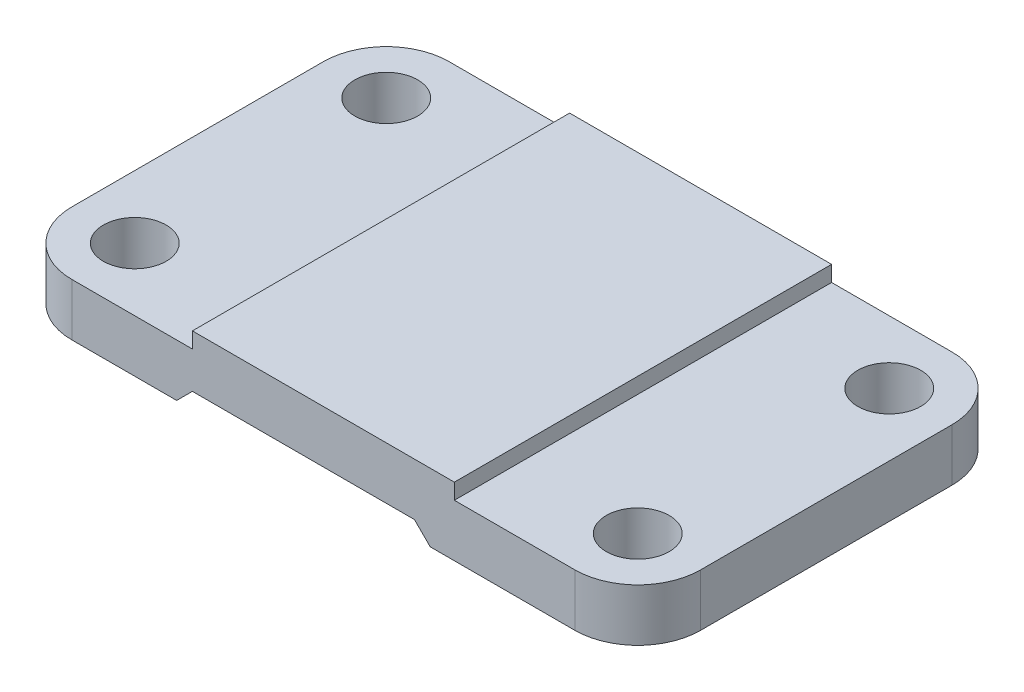
ISO-10303-21;
HEADER;
FILE_DESCRIPTION(('STEP AP214'),'2;1');
FILE_NAME('part.step','',(''),(''),'','','');
FILE_SCHEMA(('AUTOMOTIVE_DESIGN { 1 0 10303 214 1 1 1 1 }'));
ENDSEC;
DATA;
#1=APPLICATION_CONTEXT('core data for automotive mechanical design processes');
#2=APPLICATION_PROTOCOL_DEFINITION('international standard','automotive_design',2000,#1);
#3=PRODUCT_CONTEXT('',#1,'mechanical');
#4=PRODUCT('Part','Part','',(#3));
#5=PRODUCT_RELATED_PRODUCT_CATEGORY('part','',(#4));
#6=PRODUCT_DEFINITION_FORMATION('','',#4);
#7=PRODUCT_DEFINITION_CONTEXT('part definition',#1,'design');
#8=PRODUCT_DEFINITION('design','',#6,#7);
#9=PRODUCT_DEFINITION_SHAPE('','',#8);
#10=(LENGTH_UNIT() NAMED_UNIT(*) SI_UNIT(.MILLI.,.METRE.));
#11=(NAMED_UNIT(*) PLANE_ANGLE_UNIT() SI_UNIT($,.RADIAN.));
#12=(NAMED_UNIT(*) SI_UNIT($,.STERADIAN.) SOLID_ANGLE_UNIT());
#13=UNCERTAINTY_MEASURE_WITH_UNIT(LENGTH_MEASURE(1.E-05),#10,'distance_accuracy_value','');
#14=(GEOMETRIC_REPRESENTATION_CONTEXT(3) GLOBAL_UNCERTAINTY_ASSIGNED_CONTEXT((#13)) GLOBAL_UNIT_ASSIGNED_CONTEXT((#10,
#11,#12)) REPRESENTATION_CONTEXT('',''));
#15=CARTESIAN_POINT('',(0.,0.,0.));
#16=DIRECTION('',(0.,0.,1.));
#17=DIRECTION('',(1.,0.,0.));
#18=AXIS2_PLACEMENT_3D('',#15,#16,#17);
#19=CARTESIAN_POINT('',(0.,10.,0.));
#20=DIRECTION('',(0.,-1.,0.));
#21=DIRECTION('',(0.,0.,-1.));
#22=AXIS2_PLACEMENT_3D('',#19,#20,#21);
#23=PLANE('',#22);
#24=CARTESIAN_POINT('',(48.,10.,24.));
#25=DIRECTION('',(0.,1.,0.));
#26=DIRECTION('',(0.,0.,1.));
#27=AXIS2_PLACEMENT_3D('',#24,#25,#26);
#28=CIRCLE('',#27,6.);
#29=CARTESIAN_POINT('',(48.,10.,30.));
#30=VERTEX_POINT('',#29);
#31=EDGE_CURVE('E212',#30,#30,#28,.T.);
#32=ORIENTED_EDGE('',*,*,#31,.F.);
#33=EDGE_LOOP('',(#32));
#34=FACE_BOUND('',#33,.T.);
#35=CARTESIAN_POINT('',(48.,10.,-24.));
#36=DIRECTION('',(0.,1.,0.));
#37=DIRECTION('',(0.,0.,1.));
#38=AXIS2_PLACEMENT_3D('',#35,#36,#37);
#39=CIRCLE('',#38,6.);
#40=CARTESIAN_POINT('',(48.,10.,-18.));
#41=VERTEX_POINT('',#40);
#42=EDGE_CURVE('E196',#41,#41,#39,.T.);
#43=ORIENTED_EDGE('',*,*,#42,.F.);
#44=EDGE_LOOP('',(#43));
#45=FACE_BOUND('',#44,.T.);
#46=DIRECTION('',(0.,0.,-1.));
#47=VECTOR('',#46,1.);
#48=CARTESIAN_POINT('',(25.,10.,36.));
#49=LINE('',#48,#47);
#50=CARTESIAN_POINT('',(25.,10.,36.));
#51=VERTEX_POINT('',#50);
#52=CARTESIAN_POINT('',(25.,10.,-36.));
#53=VERTEX_POINT('',#52);
#54=EDGE_CURVE('E170',#51,#53,#49,.T.);
#55=ORIENTED_EDGE('',*,*,#54,.F.);
#56=DIRECTION('',(1.,0.,0.));
#57=VECTOR('',#56,1.);
#58=CARTESIAN_POINT('',(-60.,10.,36.));
#59=LINE('',#58,#57);
#60=CARTESIAN_POINT('',(48.,10.,36.));
#61=VERTEX_POINT('',#60);
#62=EDGE_CURVE('E235',#51,#61,#59,.T.);
#63=ORIENTED_EDGE('',*,*,#62,.T.);
#64=CARTESIAN_POINT('',(48.,10.,24.));
#65=DIRECTION('',(0.,-1.,0.));
#66=DIRECTION('',(0.,0.,-1.));
#67=AXIS2_PLACEMENT_3D('',#64,#65,#66);
#68=CIRCLE('',#67,12.);
#69=CARTESIAN_POINT('',(60.,10.,24.));
#70=VERTEX_POINT('',#69);
#71=EDGE_CURVE('E277',#61,#70,#68,.F.);
#72=ORIENTED_EDGE('',*,*,#71,.T.);
#73=DIRECTION('',(0.,0.,-1.));
#74=VECTOR('',#73,1.);
#75=CARTESIAN_POINT('',(60.,10.,36.));
#76=LINE('',#75,#74);
#77=CARTESIAN_POINT('',(60.,10.,-24.));
#78=VERTEX_POINT('',#77);
#79=EDGE_CURVE('E226',#70,#78,#76,.T.);
#80=ORIENTED_EDGE('',*,*,#79,.T.);
#81=CARTESIAN_POINT('',(48.,10.,-24.));
#82=DIRECTION('',(0.,-1.,0.));
#83=DIRECTION('',(0.,0.,-1.));
#84=AXIS2_PLACEMENT_3D('',#81,#82,#83);
#85=CIRCLE('',#84,12.);
#86=CARTESIAN_POINT('',(48.,10.,-36.));
#87=VERTEX_POINT('',#86);
#88=EDGE_CURVE('E275',#78,#87,#85,.F.);
#89=ORIENTED_EDGE('',*,*,#88,.T.);
#90=DIRECTION('',(-1.,0.,0.));
#91=VECTOR('',#90,1.);
#92=CARTESIAN_POINT('',(-60.,10.,-36.));
#93=LINE('',#92,#91);
#94=EDGE_CURVE('E59',#87,#53,#93,.T.);
#95=ORIENTED_EDGE('',*,*,#94,.T.);
#96=EDGE_LOOP('',(#55,#63,#72,#80,#89,#95));
#97=FACE_BOUND('',#96,.T.);
#98=ADVANCED_FACE('F36',(#34,#45,#97),#23,.F.);
#99=CARTESIAN_POINT('',(-48.,10.,-24.));
#100=DIRECTION('',(0.,1.,0.));
#101=DIRECTION('',(0.,0.,1.));
#102=AXIS2_PLACEMENT_3D('',#99,#100,#101);
#103=CIRCLE('',#102,6.);
#104=CARTESIAN_POINT('',(-48.,10.,-18.));
#105=VERTEX_POINT('',#104);
#106=EDGE_CURVE('E205',#105,#105,#103,.T.);
#107=ORIENTED_EDGE('',*,*,#106,.F.);
#108=EDGE_LOOP('',(#107));
#109=FACE_BOUND('',#108,.T.);
#110=CARTESIAN_POINT('',(-48.,10.,24.));
#111=DIRECTION('',(0.,1.,0.));
#112=DIRECTION('',(0.,0.,1.));
#113=AXIS2_PLACEMENT_3D('',#110,#111,#112);
#114=CIRCLE('',#113,6.);
#115=CARTESIAN_POINT('',(-48.,10.,30.));
#116=VERTEX_POINT('',#115);
#117=EDGE_CURVE('E206',#116,#116,#114,.T.);
#118=ORIENTED_EDGE('',*,*,#117,.F.);
#119=EDGE_LOOP('',(#118));
#120=FACE_BOUND('',#119,.T.);
#121=DIRECTION('',(0.,0.,1.));
#122=VECTOR('',#121,1.);
#123=CARTESIAN_POINT('',(-25.,10.,36.));
#124=LINE('',#123,#122);
#125=CARTESIAN_POINT('',(-25.,10.,-36.));
#126=VERTEX_POINT('',#125);
#127=CARTESIAN_POINT('',(-25.,10.,36.));
#128=VERTEX_POINT('',#127);
#129=EDGE_CURVE('E51',#126,#128,#124,.T.);
#130=ORIENTED_EDGE('',*,*,#129,.F.);
#131=CARTESIAN_POINT('',(-48.,10.,-36.));
#132=VERTEX_POINT('',#131);
#133=EDGE_CURVE('E229',#126,#132,#93,.T.);
#134=ORIENTED_EDGE('',*,*,#133,.T.);
#135=CARTESIAN_POINT('',(-48.,10.,-24.));
#136=DIRECTION('',(0.,-1.,0.));
#137=DIRECTION('',(0.,0.,-1.));
#138=AXIS2_PLACEMENT_3D('',#135,#136,#137);
#139=CIRCLE('',#138,12.);
#140=CARTESIAN_POINT('',(-60.,10.,-24.));
#141=VERTEX_POINT('',#140);
#142=EDGE_CURVE('E271',#132,#141,#139,.F.);
#143=ORIENTED_EDGE('',*,*,#142,.T.);
#144=DIRECTION('',(0.,0.,1.));
#145=VECTOR('',#144,1.);
#146=CARTESIAN_POINT('',(-60.,10.,36.));
#147=LINE('',#146,#145);
#148=CARTESIAN_POINT('',(-60.,10.,24.));
#149=VERTEX_POINT('',#148);
#150=EDGE_CURVE('E232',#141,#149,#147,.T.);
#151=ORIENTED_EDGE('',*,*,#150,.T.);
#152=CARTESIAN_POINT('',(-48.,10.,24.));
#153=DIRECTION('',(0.,-1.,0.));
#154=DIRECTION('',(0.,0.,-1.));
#155=AXIS2_PLACEMENT_3D('',#152,#153,#154);
#156=CIRCLE('',#155,12.);
#157=CARTESIAN_POINT('',(-48.,10.,36.));
#158=VERTEX_POINT('',#157);
#159=EDGE_CURVE('E273',#149,#158,#156,.F.);
#160=ORIENTED_EDGE('',*,*,#159,.T.);
#161=EDGE_CURVE('E236',#158,#128,#59,.T.);
#162=ORIENTED_EDGE('',*,*,#161,.T.);
#163=EDGE_LOOP('',(#130,#134,#143,#151,#160,#162));
#164=FACE_BOUND('',#163,.T.);
#165=ADVANCED_FACE('F309',(#109,#120,#164),#23,.F.);
#166=CARTESIAN_POINT('',(0.,0.,0.));
#167=DIRECTION('',(0.,-1.,0.));
#168=DIRECTION('',(0.,0.,-1.));
#169=AXIS2_PLACEMENT_3D('',#166,#167,#168);
#170=PLANE('',#169);
#171=DIRECTION('',(0.,0.,1.));
#172=VECTOR('',#171,1.);
#173=CARTESIAN_POINT('',(-28.,0.,-36.));
#174=LINE('',#173,#172);
#175=CARTESIAN_POINT('',(-28.,0.,-36.));
#176=VERTEX_POINT('',#175);
#177=CARTESIAN_POINT('',(-28.,0.,36.));
#178=VERTEX_POINT('',#177);
#179=EDGE_CURVE('E193',#176,#178,#174,.T.);
#180=ORIENTED_EDGE('',*,*,#179,.T.);
#181=DIRECTION('',(1.,0.,0.));
#182=VECTOR('',#181,1.);
#183=CARTESIAN_POINT('',(-60.,0.,36.));
#184=LINE('',#183,#182);
#185=CARTESIAN_POINT('',(-48.,0.,36.));
#186=VERTEX_POINT('',#185);
#187=EDGE_CURVE('E230',#186,#178,#184,.T.);
#188=ORIENTED_EDGE('',*,*,#187,.F.);
#189=CARTESIAN_POINT('',(-48.,0.,24.));
#190=DIRECTION('',(0.,-1.,0.));
#191=DIRECTION('',(0.,0.,-1.));
#192=AXIS2_PLACEMENT_3D('',#189,#190,#191);
#193=CIRCLE('',#192,12.);
#194=CARTESIAN_POINT('',(-60.,0.,24.));
#195=VERTEX_POINT('',#194);
#196=EDGE_CURVE('E258',#186,#195,#193,.T.);
#197=ORIENTED_EDGE('',*,*,#196,.T.);
#198=DIRECTION('',(0.,0.,1.));
#199=VECTOR('',#198,1.);
#200=CARTESIAN_POINT('',(-60.,0.,36.));
#201=LINE('',#200,#199);
#202=CARTESIAN_POINT('',(-60.,0.,-24.));
#203=VERTEX_POINT('',#202);
#204=EDGE_CURVE('E245',#203,#195,#201,.T.);
#205=ORIENTED_EDGE('',*,*,#204,.F.);
#206=CARTESIAN_POINT('',(-48.,0.,-24.));
#207=DIRECTION('',(0.,-1.,0.));
#208=DIRECTION('',(0.,0.,-1.));
#209=AXIS2_PLACEMENT_3D('',#206,#207,#208);
#210=CIRCLE('',#209,12.);
#211=CARTESIAN_POINT('',(-48.,0.,-36.));
#212=VERTEX_POINT('',#211);
#213=EDGE_CURVE('E255',#203,#212,#210,.T.);
#214=ORIENTED_EDGE('',*,*,#213,.T.);
#215=DIRECTION('',(-1.,0.,0.));
#216=VECTOR('',#215,1.);
#217=CARTESIAN_POINT('',(-60.,0.,-36.));
#218=LINE('',#217,#216);
#219=EDGE_CURVE('E241',#176,#212,#218,.T.);
#220=ORIENTED_EDGE('',*,*,#219,.F.);
#221=EDGE_LOOP('',(#180,#188,#197,#205,#214,#220));
#222=FACE_BOUND('',#221,.T.);
#223=CARTESIAN_POINT('',(-48.,0.,-24.));
#224=DIRECTION('',(0.,1.,0.));
#225=DIRECTION('',(0.,0.,1.));
#226=AXIS2_PLACEMENT_3D('',#223,#224,#225);
#227=CIRCLE('',#226,6.);
#228=CARTESIAN_POINT('',(-48.,0.,-18.));
#229=VERTEX_POINT('',#228);
#230=EDGE_CURVE('E220',#229,#229,#227,.T.);
#231=ORIENTED_EDGE('',*,*,#230,.T.);
#232=EDGE_LOOP('',(#231));
#233=FACE_BOUND('',#232,.T.);
#234=CARTESIAN_POINT('',(-48.,0.,24.));
#235=DIRECTION('',(0.,1.,0.));
#236=DIRECTION('',(0.,0.,1.));
#237=AXIS2_PLACEMENT_3D('',#234,#235,#236);
#238=CIRCLE('',#237,6.);
#239=CARTESIAN_POINT('',(-48.,0.,30.));
#240=VERTEX_POINT('',#239);
#241=EDGE_CURVE('E202',#240,#240,#238,.T.);
#242=ORIENTED_EDGE('',*,*,#241,.T.);
#243=EDGE_LOOP('',(#242));
#244=FACE_BOUND('',#243,.T.);
#245=ADVANCED_FACE('F294',(#222,#233,#244),#170,.T.);
#246=CARTESIAN_POINT('',(60.,10.,36.));
#247=DIRECTION('',(-1.,0.,0.));
#248=DIRECTION('',(0.,0.,1.));
#249=AXIS2_PLACEMENT_3D('',#246,#247,#248);
#250=PLANE('',#249);
#251=ORIENTED_EDGE('',*,*,#79,.F.);
#252=DIRECTION('',(0.,-1.,0.));
#253=VECTOR('',#252,1.);
#254=CARTESIAN_POINT('',(60.,10.,24.));
#255=LINE('',#254,#253);
#256=CARTESIAN_POINT('',(60.,0.,24.));
#257=VERTEX_POINT('',#256);
#258=EDGE_CURVE('E252',#70,#257,#255,.T.);
#259=ORIENTED_EDGE('',*,*,#258,.T.);
#260=DIRECTION('',(0.,0.,-1.));
#261=VECTOR('',#260,1.);
#262=CARTESIAN_POINT('',(60.,0.,36.));
#263=LINE('',#262,#261);
#264=CARTESIAN_POINT('',(60.,0.,-24.));
#265=VERTEX_POINT('',#264);
#266=EDGE_CURVE('E223',#257,#265,#263,.T.);
#267=ORIENTED_EDGE('',*,*,#266,.T.);
#268=DIRECTION('',(0.,-1.,0.));
#269=VECTOR('',#268,1.);
#270=CARTESIAN_POINT('',(60.,10.,-24.));
#271=LINE('',#270,#269);
#272=EDGE_CURVE('E238',#265,#78,#271,.F.);
#273=ORIENTED_EDGE('',*,*,#272,.T.);
#274=EDGE_LOOP('',(#251,#259,#267,#273));
#275=FACE_BOUND('',#274,.T.);
#276=ADVANCED_FACE('F326',(#275),#250,.F.);
#277=CARTESIAN_POINT('',(-60.,10.,-36.));
#278=DIRECTION('',(0.,0.,1.));
#279=DIRECTION('',(1.,0.,0.));
#280=AXIS2_PLACEMENT_3D('',#277,#278,#279);
#281=PLANE('',#280);
#282=DIRECTION('',(-1.,0.,0.));
#283=VECTOR('',#282,1.);
#284=CARTESIAN_POINT('',(-25.,2.99999999999999,-36.));
#285=LINE('',#284,#283);
#286=CARTESIAN_POINT('',(17.3887014212807,2.99999999999999,-36.));
#287=VERTEX_POINT('',#286);
#288=CARTESIAN_POINT('',(-25.,2.99999999999999,-36.));
#289=VERTEX_POINT('',#288);
#290=EDGE_CURVE('E183',#287,#289,#285,.T.);
#291=ORIENTED_EDGE('',*,*,#290,.T.);
#292=DIRECTION('',(-0.707106781186551,-0.707106781186544,0.));
#293=VECTOR('',#292,1.);
#294=CARTESIAN_POINT('',(-28.,0.,-36.));
#295=LINE('',#294,#293);
#296=EDGE_CURVE('E186',#289,#176,#295,.T.);
#297=ORIENTED_EDGE('',*,*,#296,.T.);
#298=ORIENTED_EDGE('',*,*,#219,.T.);
#299=DIRECTION('',(0.,-1.,0.));
#300=VECTOR('',#299,1.);
#301=CARTESIAN_POINT('',(-48.,10.,-36.));
#302=LINE('',#301,#300);
#303=EDGE_CURVE('E279',#212,#132,#302,.F.);
#304=ORIENTED_EDGE('',*,*,#303,.T.);
#305=ORIENTED_EDGE('',*,*,#133,.F.);
#306=DIRECTION('',(0.,-1.,0.));
#307=VECTOR('',#306,1.);
#308=CARTESIAN_POINT('',(-25.,13.,-36.));
#309=LINE('',#308,#307);
#310=CARTESIAN_POINT('',(-25.,13.,-36.));
#311=VERTEX_POINT('',#310);
#312=EDGE_CURVE('E155',#311,#126,#309,.T.);
#313=ORIENTED_EDGE('',*,*,#312,.F.);
#314=DIRECTION('',(-1.,0.,0.));
#315=VECTOR('',#314,1.);
#316=CARTESIAN_POINT('',(-25.,13.,-36.));
#317=LINE('',#316,#315);
#318=CARTESIAN_POINT('',(25.,13.,-36.));
#319=VERTEX_POINT('',#318);
#320=EDGE_CURVE('E147',#319,#311,#317,.T.);
#321=ORIENTED_EDGE('',*,*,#320,.F.);
#322=DIRECTION('',(0.,-1.,0.));
#323=VECTOR('',#322,1.);
#324=CARTESIAN_POINT('',(25.,13.,-36.));
#325=LINE('',#324,#323);
#326=EDGE_CURVE('E152',#319,#53,#325,.T.);
#327=ORIENTED_EDGE('',*,*,#326,.T.);
#328=ORIENTED_EDGE('',*,*,#94,.F.);
#329=DIRECTION('',(0.,-1.,0.));
#330=VECTOR('',#329,1.);
#331=CARTESIAN_POINT('',(48.,10.,-36.));
#332=LINE('',#331,#330);
#333=CARTESIAN_POINT('',(48.,0.,-36.));
#334=VERTEX_POINT('',#333);
#335=EDGE_CURVE('E282',#87,#334,#332,.T.);
#336=ORIENTED_EDGE('',*,*,#335,.T.);
#337=CARTESIAN_POINT('',(20.3887014212808,0.,-36.));
#338=VERTEX_POINT('',#337);
#339=EDGE_CURVE('E242',#334,#338,#218,.T.);
#340=ORIENTED_EDGE('',*,*,#339,.T.);
#341=DIRECTION('',(-0.707106781186552,0.707106781186543,0.));
#342=VECTOR('',#341,1.);
#343=CARTESIAN_POINT('',(17.3887014212807,2.99999999999999,-36.));
#344=LINE('',#343,#342);
#345=EDGE_CURVE('E180',#338,#287,#344,.T.);
#346=ORIENTED_EDGE('',*,*,#345,.T.);
#347=EDGE_LOOP('',(#291,#297,#298,#304,#305,#313,#321,#327,#328,#336,#340,#346));
#348=FACE_BOUND('',#347,.T.);
#349=ADVANCED_FACE('F150',(#348),#281,.F.);
#350=CARTESIAN_POINT('',(-60.,10.,36.));
#351=DIRECTION('',(1.,0.,0.));
#352=DIRECTION('',(0.,0.,-1.));
#353=AXIS2_PLACEMENT_3D('',#350,#351,#352);
#354=PLANE('',#353);
#355=ORIENTED_EDGE('',*,*,#204,.T.);
#356=DIRECTION('',(0.,-1.,0.));
#357=VECTOR('',#356,1.);
#358=CARTESIAN_POINT('',(-60.,10.,24.));
#359=LINE('',#358,#357);
#360=EDGE_CURVE('E11',#195,#149,#359,.F.);
#361=ORIENTED_EDGE('',*,*,#360,.T.);
#362=ORIENTED_EDGE('',*,*,#150,.F.);
#363=DIRECTION('',(0.,-1.,0.));
#364=VECTOR('',#363,1.);
#365=CARTESIAN_POINT('',(-60.,10.,-24.));
#366=LINE('',#365,#364);
#367=EDGE_CURVE('E44',#141,#203,#366,.T.);
#368=ORIENTED_EDGE('',*,*,#367,.T.);
#369=EDGE_LOOP('',(#355,#361,#362,#368));
#370=FACE_BOUND('',#369,.T.);
#371=ADVANCED_FACE('F289',(#370),#354,.F.);
#372=CARTESIAN_POINT('',(-60.,10.,36.));
#373=DIRECTION('',(0.,0.,-1.));
#374=DIRECTION('',(-1.,0.,0.));
#375=AXIS2_PLACEMENT_3D('',#372,#373,#374);
#376=PLANE('',#375);
#377=ORIENTED_EDGE('',*,*,#187,.T.);
#378=DIRECTION('',(-0.707106781186551,-0.707106781186544,0.));
#379=VECTOR('',#378,1.);
#380=CARTESIAN_POINT('',(-28.,0.,36.));
#381=LINE('',#380,#379);
#382=CARTESIAN_POINT('',(-25.,2.99999999999999,36.));
#383=VERTEX_POINT('',#382);
#384=EDGE_CURVE('E184',#383,#178,#381,.T.);
#385=ORIENTED_EDGE('',*,*,#384,.F.);
#386=DIRECTION('',(-1.,0.,0.));
#387=VECTOR('',#386,1.);
#388=CARTESIAN_POINT('',(-25.,2.99999999999999,36.));
#389=LINE('',#388,#387);
#390=CARTESIAN_POINT('',(17.3887014212807,2.99999999999999,36.));
#391=VERTEX_POINT('',#390);
#392=EDGE_CURVE('E174',#391,#383,#389,.T.);
#393=ORIENTED_EDGE('',*,*,#392,.F.);
#394=DIRECTION('',(-0.707106781186552,0.707106781186543,0.));
#395=VECTOR('',#394,1.);
#396=CARTESIAN_POINT('',(17.3887014212807,2.99999999999999,36.));
#397=LINE('',#396,#395);
#398=CARTESIAN_POINT('',(20.3887014212808,0.,36.));
#399=VERTEX_POINT('',#398);
#400=EDGE_CURVE('E171',#399,#391,#397,.T.);
#401=ORIENTED_EDGE('',*,*,#400,.F.);
#402=CARTESIAN_POINT('',(48.,0.,36.));
#403=VERTEX_POINT('',#402);
#404=EDGE_CURVE('E248',#399,#403,#184,.T.);
#405=ORIENTED_EDGE('',*,*,#404,.T.);
#406=DIRECTION('',(0.,-1.,0.));
#407=VECTOR('',#406,1.);
#408=CARTESIAN_POINT('',(48.,10.,36.));
#409=LINE('',#408,#407);
#410=EDGE_CURVE('E268',#403,#61,#409,.F.);
#411=ORIENTED_EDGE('',*,*,#410,.T.);
#412=ORIENTED_EDGE('',*,*,#62,.F.);
#413=DIRECTION('',(0.,-1.,0.));
#414=VECTOR('',#413,1.);
#415=CARTESIAN_POINT('',(25.,13.,36.));
#416=LINE('',#415,#414);
#417=CARTESIAN_POINT('',(25.,13.,36.));
#418=VERTEX_POINT('',#417);
#419=EDGE_CURVE('E316',#418,#51,#416,.T.);
#420=ORIENTED_EDGE('',*,*,#419,.F.);
#421=DIRECTION('',(1.,0.,0.));
#422=VECTOR('',#421,1.);
#423=CARTESIAN_POINT('',(-25.,13.,36.));
#424=LINE('',#423,#422);
#425=CARTESIAN_POINT('',(-25.,13.,36.));
#426=VERTEX_POINT('',#425);
#427=EDGE_CURVE('E164',#426,#418,#424,.T.);
#428=ORIENTED_EDGE('',*,*,#427,.F.);
#429=DIRECTION('',(0.,-1.,0.));
#430=VECTOR('',#429,1.);
#431=CARTESIAN_POINT('',(-25.,13.,36.));
#432=LINE('',#431,#430);
#433=EDGE_CURVE('E176',#426,#128,#432,.T.);
#434=ORIENTED_EDGE('',*,*,#433,.T.);
#435=ORIENTED_EDGE('',*,*,#161,.F.);
#436=DIRECTION('',(0.,-1.,0.));
#437=VECTOR('',#436,1.);
#438=CARTESIAN_POINT('',(-48.,10.,36.));
#439=LINE('',#438,#437);
#440=EDGE_CURVE('E265',#158,#186,#439,.T.);
#441=ORIENTED_EDGE('',*,*,#440,.T.);
#442=EDGE_LOOP('',(#377,#385,#393,#401,#405,#411,#412,#420,#428,#434,#435,#441));
#443=FACE_BOUND('',#442,.T.);
#444=ADVANCED_FACE('F305',(#443),#376,.F.);
#445=DIRECTION('',(0.,0.,1.));
#446=VECTOR('',#445,1.);
#447=CARTESIAN_POINT('',(20.3887014212808,0.,-36.));
#448=LINE('',#447,#446);
#449=EDGE_CURVE('E188',#338,#399,#448,.T.);
#450=ORIENTED_EDGE('',*,*,#449,.F.);
#451=ORIENTED_EDGE('',*,*,#339,.F.);
#452=CARTESIAN_POINT('',(48.,0.,-24.));
#453=DIRECTION('',(0.,-1.,0.));
#454=DIRECTION('',(0.,0.,-1.));
#455=AXIS2_PLACEMENT_3D('',#452,#453,#454);
#456=CIRCLE('',#455,12.);
#457=EDGE_CURVE('E260',#334,#265,#456,.T.);
#458=ORIENTED_EDGE('',*,*,#457,.T.);
#459=ORIENTED_EDGE('',*,*,#266,.F.);
#460=CARTESIAN_POINT('',(48.,0.,24.));
#461=DIRECTION('',(0.,-1.,0.));
#462=DIRECTION('',(0.,0.,-1.));
#463=AXIS2_PLACEMENT_3D('',#460,#461,#462);
#464=CIRCLE('',#463,12.);
#465=EDGE_CURVE('E262',#257,#403,#464,.T.);
#466=ORIENTED_EDGE('',*,*,#465,.T.);
#467=ORIENTED_EDGE('',*,*,#404,.F.);
#468=EDGE_LOOP('',(#450,#451,#458,#459,#466,#467));
#469=FACE_BOUND('',#468,.T.);
#470=CARTESIAN_POINT('',(48.,0.,-24.));
#471=DIRECTION('',(0.,1.,0.));
#472=DIRECTION('',(0.,0.,1.));
#473=AXIS2_PLACEMENT_3D('',#470,#471,#472);
#474=CIRCLE('',#473,6.);
#475=CARTESIAN_POINT('',(48.,0.,-18.));
#476=VERTEX_POINT('',#475);
#477=EDGE_CURVE('E215',#476,#476,#474,.T.);
#478=ORIENTED_EDGE('',*,*,#477,.T.);
#479=EDGE_LOOP('',(#478));
#480=FACE_BOUND('',#479,.T.);
#481=CARTESIAN_POINT('',(48.,0.,24.));
#482=DIRECTION('',(0.,1.,0.));
#483=DIRECTION('',(0.,0.,1.));
#484=AXIS2_PLACEMENT_3D('',#481,#482,#483);
#485=CIRCLE('',#484,6.);
#486=CARTESIAN_POINT('',(48.,0.,30.));
#487=VERTEX_POINT('',#486);
#488=EDGE_CURVE('E209',#487,#487,#485,.T.);
#489=ORIENTED_EDGE('',*,*,#488,.T.);
#490=EDGE_LOOP('',(#489));
#491=FACE_BOUND('',#490,.T.);
#492=ADVANCED_FACE('F333',(#469,#480,#491),#170,.T.);
#493=CARTESIAN_POINT('',(-48.,0.,-24.));
#494=DIRECTION('',(0.,1.,0.));
#495=DIRECTION('',(0.,0.,1.));
#496=AXIS2_PLACEMENT_3D('',#493,#494,#495);
#497=CYLINDRICAL_SURFACE('',#496,6.);
#498=ORIENTED_EDGE('',*,*,#230,.F.);
#499=EDGE_LOOP('',(#498));
#500=FACE_BOUND('',#499,.T.);
#501=ORIENTED_EDGE('',*,*,#106,.T.);
#502=EDGE_LOOP('',(#501));
#503=FACE_BOUND('',#502,.T.);
#504=ADVANCED_FACE('F368',(#500,#503),#497,.F.);
#505=CARTESIAN_POINT('',(-48.,0.,24.));
#506=DIRECTION('',(0.,1.,0.));
#507=DIRECTION('',(0.,0.,1.));
#508=AXIS2_PLACEMENT_3D('',#505,#506,#507);
#509=CYLINDRICAL_SURFACE('',#508,6.);
#510=ORIENTED_EDGE('',*,*,#241,.F.);
#511=EDGE_LOOP('',(#510));
#512=FACE_BOUND('',#511,.T.);
#513=ORIENTED_EDGE('',*,*,#117,.T.);
#514=EDGE_LOOP('',(#513));
#515=FACE_BOUND('',#514,.T.);
#516=ADVANCED_FACE('F509',(#512,#515),#509,.F.);
#517=CARTESIAN_POINT('',(48.,0.,24.));
#518=DIRECTION('',(0.,1.,0.));
#519=DIRECTION('',(0.,0.,1.));
#520=AXIS2_PLACEMENT_3D('',#517,#518,#519);
#521=CYLINDRICAL_SURFACE('',#520,6.);
#522=ORIENTED_EDGE('',*,*,#488,.F.);
#523=EDGE_LOOP('',(#522));
#524=FACE_BOUND('',#523,.T.);
#525=ORIENTED_EDGE('',*,*,#31,.T.);
#526=EDGE_LOOP('',(#525));
#527=FACE_BOUND('',#526,.T.);
#528=ADVANCED_FACE('F503',(#524,#527),#521,.F.);
#529=CARTESIAN_POINT('',(48.,0.,-24.));
#530=DIRECTION('',(0.,1.,0.));
#531=DIRECTION('',(0.,0.,1.));
#532=AXIS2_PLACEMENT_3D('',#529,#530,#531);
#533=CYLINDRICAL_SURFACE('',#532,6.);
#534=ORIENTED_EDGE('',*,*,#477,.F.);
#535=EDGE_LOOP('',(#534));
#536=FACE_BOUND('',#535,.T.);
#537=ORIENTED_EDGE('',*,*,#42,.T.);
#538=EDGE_LOOP('',(#537));
#539=FACE_BOUND('',#538,.T.);
#540=ADVANCED_FACE('F382',(#536,#539),#533,.F.);
#541=CARTESIAN_POINT('',(48.,10.,24.));
#542=DIRECTION('',(0.,-1.,0.));
#543=DIRECTION('',(0.,0.,-1.));
#544=AXIS2_PLACEMENT_3D('',#541,#542,#543);
#545=CYLINDRICAL_SURFACE('',#544,12.);
#546=ORIENTED_EDGE('',*,*,#71,.F.);
#547=ORIENTED_EDGE('',*,*,#410,.F.);
#548=ORIENTED_EDGE('',*,*,#465,.F.);
#549=ORIENTED_EDGE('',*,*,#258,.F.);
#550=EDGE_LOOP('',(#546,#547,#548,#549));
#551=FACE_BOUND('',#550,.T.);
#552=ADVANCED_FACE('F329',(#551),#545,.T.);
#553=CARTESIAN_POINT('',(48.,10.,-24.));
#554=DIRECTION('',(0.,-1.,0.));
#555=DIRECTION('',(0.,0.,-1.));
#556=AXIS2_PLACEMENT_3D('',#553,#554,#555);
#557=CYLINDRICAL_SURFACE('',#556,12.);
#558=ORIENTED_EDGE('',*,*,#88,.F.);
#559=ORIENTED_EDGE('',*,*,#272,.F.);
#560=ORIENTED_EDGE('',*,*,#457,.F.);
#561=ORIENTED_EDGE('',*,*,#335,.F.);
#562=EDGE_LOOP('',(#558,#559,#560,#561));
#563=FACE_BOUND('',#562,.T.);
#564=ADVANCED_FACE('F337',(#563),#557,.T.);
#565=CARTESIAN_POINT('',(-48.,10.,24.));
#566=DIRECTION('',(0.,-1.,0.));
#567=DIRECTION('',(0.,0.,-1.));
#568=AXIS2_PLACEMENT_3D('',#565,#566,#567);
#569=CYLINDRICAL_SURFACE('',#568,12.);
#570=ORIENTED_EDGE('',*,*,#159,.F.);
#571=ORIENTED_EDGE('',*,*,#360,.F.);
#572=ORIENTED_EDGE('',*,*,#196,.F.);
#573=ORIENTED_EDGE('',*,*,#440,.F.);
#574=EDGE_LOOP('',(#570,#571,#572,#573));
#575=FACE_BOUND('',#574,.T.);
#576=ADVANCED_FACE('F302',(#575),#569,.T.);
#577=CARTESIAN_POINT('',(-48.,10.,-24.));
#578=DIRECTION('',(0.,-1.,0.));
#579=DIRECTION('',(0.,0.,-1.));
#580=AXIS2_PLACEMENT_3D('',#577,#578,#579);
#581=CYLINDRICAL_SURFACE('',#580,12.);
#582=ORIENTED_EDGE('',*,*,#142,.F.);
#583=ORIENTED_EDGE('',*,*,#303,.F.);
#584=ORIENTED_EDGE('',*,*,#213,.F.);
#585=ORIENTED_EDGE('',*,*,#367,.F.);
#586=EDGE_LOOP('',(#582,#583,#584,#585));
#587=FACE_BOUND('',#586,.T.);
#588=ADVANCED_FACE('F38',(#587),#581,.T.);
#589=CARTESIAN_POINT('',(-28.,0.,-36.));
#590=DIRECTION('',(-0.707106781186544,0.707106781186551,0.));
#591=DIRECTION('',(-0.707106781186551,-0.707106781186544,0.));
#592=AXIS2_PLACEMENT_3D('',#589,#590,#591);
#593=PLANE('',#592);
#594=ORIENTED_EDGE('',*,*,#384,.T.);
#595=ORIENTED_EDGE('',*,*,#179,.F.);
#596=ORIENTED_EDGE('',*,*,#296,.F.);
#597=DIRECTION('',(0.,0.,1.));
#598=VECTOR('',#597,1.);
#599=CARTESIAN_POINT('',(-25.,2.99999999999999,-36.));
#600=LINE('',#599,#598);
#601=EDGE_CURVE('E197',#289,#383,#600,.T.);
#602=ORIENTED_EDGE('',*,*,#601,.T.);
#603=EDGE_LOOP('',(#594,#595,#596,#602));
#604=FACE_BOUND('',#603,.T.);
#605=ADVANCED_FACE('F348',(#604),#593,.F.);
#606=CARTESIAN_POINT('',(-25.,2.99999999999999,-36.));
#607=DIRECTION('',(0.,1.,0.));
#608=DIRECTION('',(0.,0.,1.));
#609=AXIS2_PLACEMENT_3D('',#606,#607,#608);
#610=PLANE('',#609);
#611=ORIENTED_EDGE('',*,*,#392,.T.);
#612=ORIENTED_EDGE('',*,*,#601,.F.);
#613=ORIENTED_EDGE('',*,*,#290,.F.);
#614=DIRECTION('',(0.,0.,1.));
#615=VECTOR('',#614,1.);
#616=CARTESIAN_POINT('',(17.3887014212807,2.99999999999999,-36.));
#617=LINE('',#616,#615);
#618=EDGE_CURVE('E199',#287,#391,#617,.T.);
#619=ORIENTED_EDGE('',*,*,#618,.T.);
#620=EDGE_LOOP('',(#611,#612,#613,#619));
#621=FACE_BOUND('',#620,.T.);
#622=ADVANCED_FACE('F344',(#621),#610,.F.);
#623=CARTESIAN_POINT('',(17.3887014212807,2.99999999999999,-36.));
#624=DIRECTION('',(0.707106781186543,0.707106781186552,0.));
#625=DIRECTION('',(-0.707106781186552,0.707106781186543,0.));
#626=AXIS2_PLACEMENT_3D('',#623,#624,#625);
#627=PLANE('',#626);
#628=ORIENTED_EDGE('',*,*,#400,.T.);
#629=ORIENTED_EDGE('',*,*,#618,.F.);
#630=ORIENTED_EDGE('',*,*,#345,.F.);
#631=ORIENTED_EDGE('',*,*,#449,.T.);
#632=EDGE_LOOP('',(#628,#629,#630,#631));
#633=FACE_BOUND('',#632,.T.);
#634=ADVANCED_FACE('F341',(#633),#627,.F.);
#635=CARTESIAN_POINT('',(25.,13.,36.));
#636=DIRECTION('',(-1.,0.,0.));
#637=DIRECTION('',(0.,0.,1.));
#638=AXIS2_PLACEMENT_3D('',#635,#636,#637);
#639=PLANE('',#638);
#640=ORIENTED_EDGE('',*,*,#54,.T.);
#641=ORIENTED_EDGE('',*,*,#326,.F.);
#642=DIRECTION('',(0.,0.,-1.));
#643=VECTOR('',#642,1.);
#644=CARTESIAN_POINT('',(25.,13.,36.));
#645=LINE('',#644,#643);
#646=EDGE_CURVE('E159',#418,#319,#645,.T.);
#647=ORIENTED_EDGE('',*,*,#646,.F.);
#648=ORIENTED_EDGE('',*,*,#419,.T.);
#649=EDGE_LOOP('',(#640,#641,#647,#648));
#650=FACE_BOUND('',#649,.T.);
#651=ADVANCED_FACE('F169',(#650),#639,.F.);
#652=CARTESIAN_POINT('',(-25.,13.,36.));
#653=DIRECTION('',(1.,0.,0.));
#654=DIRECTION('',(0.,0.,-1.));
#655=AXIS2_PLACEMENT_3D('',#652,#653,#654);
#656=PLANE('',#655);
#657=ORIENTED_EDGE('',*,*,#129,.T.);
#658=ORIENTED_EDGE('',*,*,#433,.F.);
#659=DIRECTION('',(0.,0.,1.));
#660=VECTOR('',#659,1.);
#661=CARTESIAN_POINT('',(-25.,13.,36.));
#662=LINE('',#661,#660);
#663=EDGE_CURVE('E158',#311,#426,#662,.T.);
#664=ORIENTED_EDGE('',*,*,#663,.F.);
#665=ORIENTED_EDGE('',*,*,#312,.T.);
#666=EDGE_LOOP('',(#657,#658,#664,#665));
#667=FACE_BOUND('',#666,.T.);
#668=ADVANCED_FACE('F311',(#667),#656,.F.);
#669=CARTESIAN_POINT('',(0.,13.,0.));
#670=DIRECTION('',(0.,-1.,0.));
#671=DIRECTION('',(0.,0.,-1.));
#672=AXIS2_PLACEMENT_3D('',#669,#670,#671);
#673=PLANE('',#672);
#674=ORIENTED_EDGE('',*,*,#646,.T.);
#675=ORIENTED_EDGE('',*,*,#320,.T.);
#676=ORIENTED_EDGE('',*,*,#663,.T.);
#677=ORIENTED_EDGE('',*,*,#427,.T.);
#678=EDGE_LOOP('',(#674,#675,#676,#677));
#679=FACE_BOUND('',#678,.T.);
#680=ADVANCED_FACE('F162',(#679),#673,.F.);
#681=CLOSED_SHELL('',(#98,#165,#245,#276,#349,#371,#444,#492,#504,#516,#528,#540,#552,#564,#576,
#588,#605,#622,#634,#651,#668,#680));
#682=MANIFOLD_SOLID_BREP('B2',#681);
#683=ADVANCED_BREP_SHAPE_REPRESENTATION('',(#18,#682),#14);
#684=SHAPE_DEFINITION_REPRESENTATION(#9,#683);
ENDSEC;
END-ISO-10303-21;
